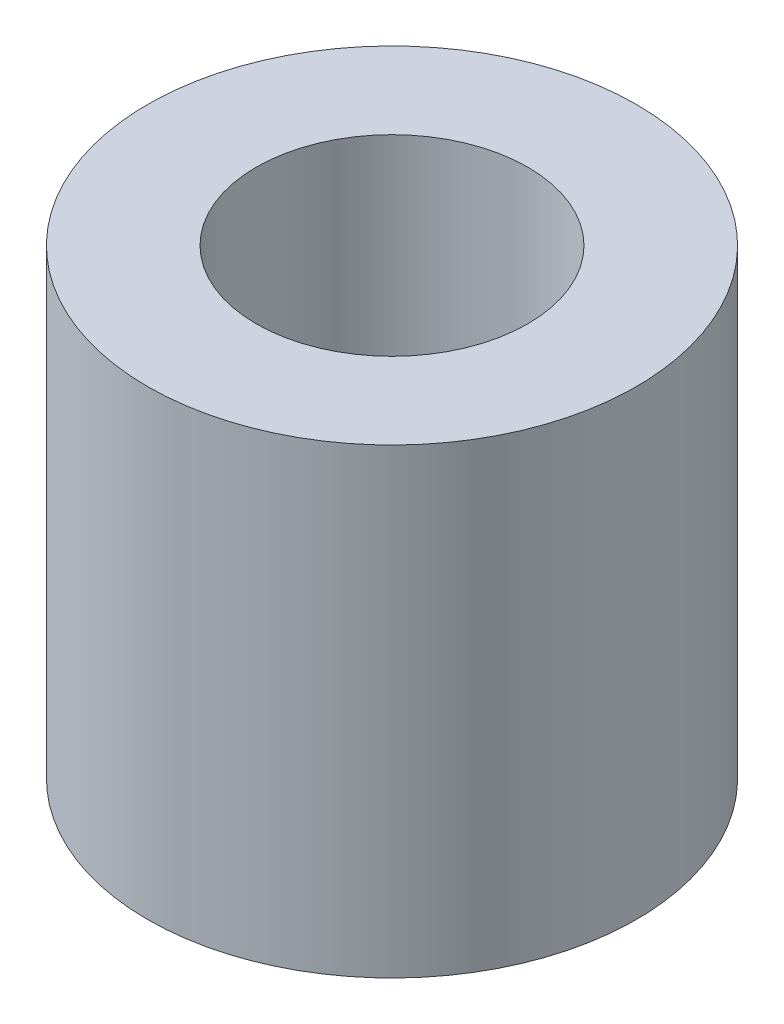
ISO-10303-21;
HEADER;
FILE_DESCRIPTION(('STEP AP214'),'2;1');
FILE_NAME('part.step','',(''),(''),'','','');
FILE_SCHEMA(('AUTOMOTIVE_DESIGN { 1 0 10303 214 1 1 1 1 }'));
ENDSEC;
DATA;
#1=APPLICATION_CONTEXT('core data for automotive mechanical design processes');
#2=APPLICATION_PROTOCOL_DEFINITION('international standard','automotive_design',2000,#1);
#3=PRODUCT_CONTEXT('',#1,'mechanical');
#4=PRODUCT('Part','Part','',(#3));
#5=PRODUCT_RELATED_PRODUCT_CATEGORY('part','',(#4));
#6=PRODUCT_DEFINITION_FORMATION('','',#4);
#7=PRODUCT_DEFINITION_CONTEXT('part definition',#1,'design');
#8=PRODUCT_DEFINITION('design','',#6,#7);
#9=PRODUCT_DEFINITION_SHAPE('','',#8);
#10=(LENGTH_UNIT() NAMED_UNIT(*) SI_UNIT(.MILLI.,.METRE.));
#11=(NAMED_UNIT(*) PLANE_ANGLE_UNIT() SI_UNIT($,.RADIAN.));
#12=(NAMED_UNIT(*) SI_UNIT($,.STERADIAN.) SOLID_ANGLE_UNIT());
#13=UNCERTAINTY_MEASURE_WITH_UNIT(LENGTH_MEASURE(1.E-05),#10,'distance_accuracy_value','');
#14=(GEOMETRIC_REPRESENTATION_CONTEXT(3) GLOBAL_UNCERTAINTY_ASSIGNED_CONTEXT((#13)) GLOBAL_UNIT_ASSIGNED_CONTEXT((#10,
#11,#12)) REPRESENTATION_CONTEXT('',''));
#15=CARTESIAN_POINT('',(0.,0.,0.));
#16=DIRECTION('',(0.,0.,1.));
#17=DIRECTION('',(1.,0.,0.));
#18=AXIS2_PLACEMENT_3D('',#15,#16,#17);
#19=CARTESIAN_POINT('',(0.,3.4,0.));
#20=DIRECTION('',(0.,1.,0.));
#21=DIRECTION('',(0.,0.,1.));
#22=AXIS2_PLACEMENT_3D('',#19,#20,#21);
#23=PLANE('',#22);
#24=CARTESIAN_POINT('',(0.,3.4,0.));
#25=DIRECTION('',(0.,1.,0.));
#26=DIRECTION('',(0.,0.,1.));
#27=AXIS2_PLACEMENT_3D('',#24,#25,#26);
#28=CIRCLE('',#27,1.8);
#29=CARTESIAN_POINT('',(0.,3.4,1.8));
#30=VERTEX_POINT('',#29);
#31=EDGE_CURVE('E10',#30,#30,#28,.T.);
#32=ORIENTED_EDGE('',*,*,#31,.T.);
#33=EDGE_LOOP('',(#32));
#34=FACE_BOUND('',#33,.T.);
#35=CARTESIAN_POINT('',(0.,3.4,0.));
#36=DIRECTION('',(0.,1.,0.));
#37=DIRECTION('',(0.,0.,1.));
#38=AXIS2_PLACEMENT_3D('',#35,#36,#37);
#39=CIRCLE('',#38,1.);
#40=CARTESIAN_POINT('',(0.,3.4,1.));
#41=VERTEX_POINT('',#40);
#42=EDGE_CURVE('E44',#41,#41,#39,.T.);
#43=ORIENTED_EDGE('',*,*,#42,.F.);
#44=EDGE_LOOP('',(#43));
#45=FACE_BOUND('',#44,.T.);
#46=ADVANCED_FACE('F33',(#34,#45),#23,.T.);
#47=CARTESIAN_POINT('',(0.,0.,0.));
#48=DIRECTION('',(0.,1.,0.));
#49=DIRECTION('',(0.,0.,1.));
#50=AXIS2_PLACEMENT_3D('',#47,#48,#49);
#51=PLANE('',#50);
#52=CARTESIAN_POINT('',(0.,0.,0.));
#53=DIRECTION('',(0.,1.,0.));
#54=DIRECTION('',(0.,0.,1.));
#55=AXIS2_PLACEMENT_3D('',#52,#53,#54);
#56=CIRCLE('',#55,1.8);
#57=CARTESIAN_POINT('',(0.,0.,1.8));
#58=VERTEX_POINT('',#57);
#59=EDGE_CURVE('E37',#58,#58,#56,.T.);
#60=ORIENTED_EDGE('',*,*,#59,.F.);
#61=EDGE_LOOP('',(#60));
#62=FACE_BOUND('',#61,.T.);
#63=CARTESIAN_POINT('',(0.,0.,0.));
#64=DIRECTION('',(0.,1.,0.));
#65=DIRECTION('',(0.,0.,1.));
#66=AXIS2_PLACEMENT_3D('',#63,#64,#65);
#67=CIRCLE('',#66,1.);
#68=CARTESIAN_POINT('',(0.,0.,1.));
#69=VERTEX_POINT('',#68);
#70=EDGE_CURVE('E46',#69,#69,#67,.T.);
#71=ORIENTED_EDGE('',*,*,#70,.T.);
#72=EDGE_LOOP('',(#71));
#73=FACE_BOUND('',#72,.T.);
#74=ADVANCED_FACE('F56',(#62,#73),#51,.F.);
#75=CARTESIAN_POINT('',(0.,3.4,0.));
#76=DIRECTION('',(0.,-1.,0.));
#77=DIRECTION('',(0.,0.,-1.));
#78=AXIS2_PLACEMENT_3D('',#75,#76,#77);
#79=CYLINDRICAL_SURFACE('',#78,1.8);
#80=ORIENTED_EDGE('',*,*,#31,.F.);
#81=EDGE_LOOP('',(#80));
#82=FACE_BOUND('',#81,.T.);
#83=ORIENTED_EDGE('',*,*,#59,.T.);
#84=EDGE_LOOP('',(#83));
#85=FACE_BOUND('',#84,.T.);
#86=ADVANCED_FACE('F35',(#82,#85),#79,.T.);
#87=CARTESIAN_POINT('',(0.,3.4,0.));
#88=DIRECTION('',(0.,-1.,0.));
#89=DIRECTION('',(0.,0.,-1.));
#90=AXIS2_PLACEMENT_3D('',#87,#88,#89);
#91=CYLINDRICAL_SURFACE('',#90,1.);
#92=ORIENTED_EDGE('',*,*,#42,.T.);
#93=EDGE_LOOP('',(#92));
#94=FACE_BOUND('',#93,.T.);
#95=ORIENTED_EDGE('',*,*,#70,.F.);
#96=EDGE_LOOP('',(#95));
#97=FACE_BOUND('',#96,.T.);
#98=ADVANCED_FACE('F52',(#94,#97),#91,.F.);
#99=CLOSED_SHELL('',(#46,#74,#86,#98));
#100=MANIFOLD_SOLID_BREP('B2',#99);
#101=ADVANCED_BREP_SHAPE_REPRESENTATION('',(#18,#100),#14);
#102=SHAPE_DEFINITION_REPRESENTATION(#9,#101);
ENDSEC;
END-ISO-10303-21;
